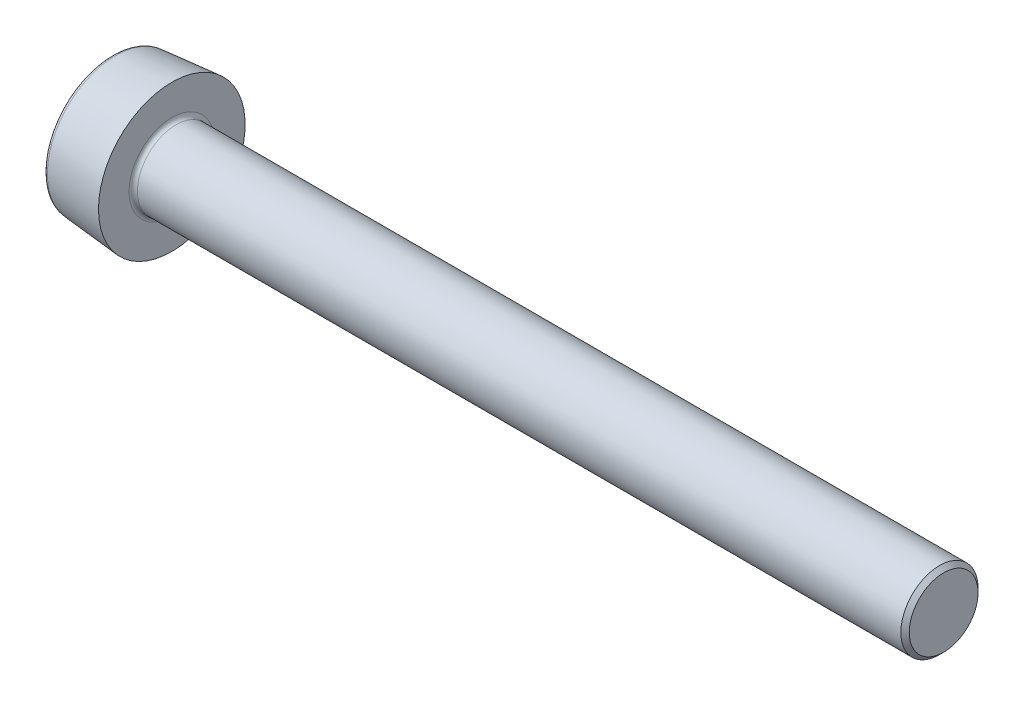
ISO-10303-21;
HEADER;
FILE_DESCRIPTION(('STEP AP214'),'2;1');
FILE_NAME('part.step','',(''),(''),'','','');
FILE_SCHEMA(('AUTOMOTIVE_DESIGN { 1 0 10303 214 1 1 1 1 }'));
ENDSEC;
DATA;
#1=APPLICATION_CONTEXT('core data for automotive mechanical design processes');
#2=APPLICATION_PROTOCOL_DEFINITION('international standard','automotive_design',2000,#1);
#3=PRODUCT_CONTEXT('',#1,'mechanical');
#4=PRODUCT('Part','Part','',(#3));
#5=PRODUCT_RELATED_PRODUCT_CATEGORY('part','',(#4));
#6=PRODUCT_DEFINITION_FORMATION('','',#4);
#7=PRODUCT_DEFINITION_CONTEXT('part definition',#1,'design');
#8=PRODUCT_DEFINITION('design','',#6,#7);
#9=PRODUCT_DEFINITION_SHAPE('','',#8);
#10=(LENGTH_UNIT() NAMED_UNIT(*) SI_UNIT(.MILLI.,.METRE.));
#11=(NAMED_UNIT(*) PLANE_ANGLE_UNIT() SI_UNIT($,.RADIAN.));
#12=(NAMED_UNIT(*) SI_UNIT($,.STERADIAN.) SOLID_ANGLE_UNIT());
#13=UNCERTAINTY_MEASURE_WITH_UNIT(LENGTH_MEASURE(1.E-05),#10,'distance_accuracy_value','');
#14=(GEOMETRIC_REPRESENTATION_CONTEXT(3) GLOBAL_UNCERTAINTY_ASSIGNED_CONTEXT((#13)) GLOBAL_UNIT_ASSIGNED_CONTEXT((#10,
#11,#12)) REPRESENTATION_CONTEXT('',''));
#15=CARTESIAN_POINT('',(0.,0.,0.));
#16=DIRECTION('',(0.,0.,1.));
#17=DIRECTION('',(1.,0.,0.));
#18=AXIS2_PLACEMENT_3D('',#15,#16,#17);
#19=CARTESIAN_POINT('',(0.,0.,0.));
#20=DIRECTION('',(-1.,0.,0.));
#21=DIRECTION('',(0.,0.,1.));
#22=AXIS2_PLACEMENT_3D('',#19,#20,#21);
#23=CYLINDRICAL_SURFACE('',#22,1.);
#24=CARTESIAN_POINT('',(19.89175,0.,0.));
#25=DIRECTION('',(-1.,0.,0.));
#26=DIRECTION('',(0.,0.,1.));
#27=AXIS2_PLACEMENT_3D('',#24,#25,#26);
#28=CIRCLE('',#27,1.);
#29=CARTESIAN_POINT('',(19.89175,0.,1.));
#30=VERTEX_POINT('',#29);
#31=EDGE_CURVE('E322',#30,#30,#28,.T.);
#32=ORIENTED_EDGE('',*,*,#31,.T.);
#33=EDGE_LOOP('',(#32));
#34=FACE_BOUND('',#33,.T.);
#35=CARTESIAN_POINT('',(0.108249999999998,0.,0.));
#36=DIRECTION('',(-1.,0.,0.));
#37=DIRECTION('',(0.,0.,1.));
#38=AXIS2_PLACEMENT_3D('',#35,#36,#37);
#39=CIRCLE('',#38,1.);
#40=CARTESIAN_POINT('',(0.108249999999998,0.,1.));
#41=VERTEX_POINT('',#40);
#42=EDGE_CURVE('E11',#41,#41,#39,.T.);
#43=ORIENTED_EDGE('',*,*,#42,.F.);
#44=EDGE_LOOP('',(#43));
#45=FACE_BOUND('',#44,.T.);
#46=ADVANCED_FACE('F17',(#34,#45),#23,.T.);
#47=CARTESIAN_POINT('',(0.108249999999998,0.,0.));
#48=DIRECTION('',(-1.,0.,0.));
#49=DIRECTION('',(0.,0.,1.));
#50=AXIS2_PLACEMENT_3D('',#47,#48,#49);
#51=TOROIDAL_SURFACE('',#50,1.10825,0.10825);
#52=ORIENTED_EDGE('',*,*,#42,.T.);
#53=EDGE_LOOP('',(#52));
#54=FACE_BOUND('',#53,.T.);
#55=CARTESIAN_POINT('',(0.,0.,0.));
#56=DIRECTION('',(-1.,0.,0.));
#57=DIRECTION('',(0.,0.,1.));
#58=AXIS2_PLACEMENT_3D('',#55,#56,#57);
#59=CIRCLE('',#58,1.10825);
#60=CARTESIAN_POINT('',(0.,0.,1.10825));
#61=VERTEX_POINT('',#60);
#62=EDGE_CURVE('E25',#61,#61,#59,.T.);
#63=ORIENTED_EDGE('',*,*,#62,.F.);
#64=EDGE_LOOP('',(#63));
#65=FACE_BOUND('',#64,.T.);
#66=ADVANCED_FACE('F354',(#54,#65),#51,.F.);
#67=CARTESIAN_POINT('',(0.,1.10825,0.));
#68=DIRECTION('',(-1.,0.,0.));
#69=DIRECTION('',(0.,0.,1.));
#70=AXIS2_PLACEMENT_3D('',#67,#68,#69);
#71=PLANE('',#70);
#72=CARTESIAN_POINT('',(0.,0.,0.));
#73=DIRECTION('',(-1.,0.,0.));
#74=DIRECTION('',(0.,0.,1.));
#75=AXIS2_PLACEMENT_3D('',#72,#73,#74);
#76=CIRCLE('',#75,1.9);
#77=CARTESIAN_POINT('',(0.,0.,1.9));
#78=VERTEX_POINT('',#77);
#79=EDGE_CURVE('E342',#78,#78,#76,.T.);
#80=ORIENTED_EDGE('',*,*,#79,.F.);
#81=EDGE_LOOP('',(#80));
#82=FACE_BOUND('',#81,.T.);
#83=ORIENTED_EDGE('',*,*,#62,.T.);
#84=EDGE_LOOP('',(#83));
#85=FACE_BOUND('',#84,.T.);
#86=ADVANCED_FACE('F352',(#82,#85),#71,.F.);
#87=CARTESIAN_POINT('',(-1.45118460915243,0.,0.));
#88=DIRECTION('',(1.,0.,0.));
#89=DIRECTION('',(0.,0.,-1.));
#90=AXIS2_PLACEMENT_3D('',#87,#88,#89);
#91=CONICAL_SURFACE('',#90,1.77303779801586,0.0872664625997164);
#92=ORIENTED_EDGE('',*,*,#79,.T.);
#93=EDGE_LOOP('',(#92));
#94=FACE_BOUND('',#93,.T.);
#95=CARTESIAN_POINT('',(-1.45118460915243,0.,0.));
#96=DIRECTION('',(-1.,0.,0.));
#97=DIRECTION('',(0.,0.,1.));
#98=AXIS2_PLACEMENT_3D('',#95,#96,#97);
#99=CIRCLE('',#98,1.77303779801586);
#100=CARTESIAN_POINT('',(-1.45118460915243,0.,1.77303779801586));
#101=VERTEX_POINT('',#100);
#102=EDGE_CURVE('E338',#101,#101,#99,.T.);
#103=ORIENTED_EDGE('',*,*,#102,.F.);
#104=EDGE_LOOP('',(#103));
#105=FACE_BOUND('',#104,.T.);
#106=ADVANCED_FACE('F362',(#94,#105),#91,.T.);
#107=CARTESIAN_POINT('',(-1.44175,0.,0.));
#108=DIRECTION('',(-1.,0.,0.));
#109=DIRECTION('',(0.,0.,1.));
#110=AXIS2_PLACEMENT_3D('',#107,#108,#109);
#111=TOROIDAL_SURFACE('',#110,1.66519972194743,0.10825);
#112=CARTESIAN_POINT('',(-1.55,0.,0.));
#113=DIRECTION('',(-1.,0.,0.));
#114=DIRECTION('',(0.,0.,1.));
#115=AXIS2_PLACEMENT_3D('',#112,#113,#114);
#116=CIRCLE('',#115,1.66519972194743);
#117=CARTESIAN_POINT('',(-1.55,0.,1.66519972194743));
#118=VERTEX_POINT('',#117);
#119=EDGE_CURVE('E334',#118,#118,#116,.T.);
#120=ORIENTED_EDGE('',*,*,#119,.F.);
#121=EDGE_LOOP('',(#120));
#122=FACE_BOUND('',#121,.T.);
#123=ORIENTED_EDGE('',*,*,#102,.T.);
#124=EDGE_LOOP('',(#123));
#125=FACE_BOUND('',#124,.T.);
#126=ADVANCED_FACE('F369',(#122,#125),#111,.T.);
#127=CARTESIAN_POINT('',(-1.55,0.,0.));
#128=DIRECTION('',(-1.,0.,0.));
#129=DIRECTION('',(0.,0.,1.));
#130=AXIS2_PLACEMENT_3D('',#127,#128,#129);
#131=PLANE('',#130);
#132=CARTESIAN_POINT('',(-1.55,-1.06088111963594,-0.6125));
#133=DIRECTION('',(1.,0.,0.));
#134=DIRECTION('',(0.,0.,-1.));
#135=AXIS2_PLACEMENT_3D('',#132,#133,#134);
#136=CIRCLE('',#135,0.554830537352329);
#137=CARTESIAN_POINT('',(-1.55,-0.514312095755914,-0.707889870078079));
#138=VERTEX_POINT('',#137);
#139=CARTESIAN_POINT('',(-1.55,-0.870206658447239,-0.0914624053591971));
#140=VERTEX_POINT('',#139);
#141=EDGE_CURVE('E217',#138,#140,#136,.T.);
#142=ORIENTED_EDGE('',*,*,#141,.F.);
#143=CARTESIAN_POINT('',(-1.55,0.,0.));
#144=DIRECTION('',(-1.,0.,0.));
#145=DIRECTION('',(0.,0.,1.));
#146=AXIS2_PLACEMENT_3D('',#143,#144,#145);
#147=CIRCLE('',#146,0.875);
#148=CARTESIAN_POINT('',(-1.55,-0.355894562691325,-0.799352275437276));
#149=VERTEX_POINT('',#148);
#150=EDGE_CURVE('E156',#149,#138,#147,.T.);
#151=ORIENTED_EDGE('',*,*,#150,.F.);
#152=CARTESIAN_POINT('',(-1.55,0.,-1.225));
#153=DIRECTION('',(1.,0.,0.));
#154=DIRECTION('',(0.,0.,-1.));
#155=AXIS2_PLACEMENT_3D('',#152,#153,#154);
#156=CIRCLE('',#155,0.554830537352329);
#157=CARTESIAN_POINT('',(-1.55,0.355894562691326,-0.799352275437276));
#158=VERTEX_POINT('',#157);
#159=EDGE_CURVE('E213',#158,#149,#156,.T.);
#160=ORIENTED_EDGE('',*,*,#159,.F.);
#161=CARTESIAN_POINT('',(-1.55,0.514312095755914,-0.707889870078079));
#162=VERTEX_POINT('',#161);
#163=EDGE_CURVE('E148',#162,#158,#147,.T.);
#164=ORIENTED_EDGE('',*,*,#163,.F.);
#165=CARTESIAN_POINT('',(-1.55,1.06088111963594,-0.6125));
#166=DIRECTION('',(1.,0.,0.));
#167=DIRECTION('',(0.,0.,-1.));
#168=AXIS2_PLACEMENT_3D('',#165,#166,#167);
#169=CIRCLE('',#168,0.554830537352329);
#170=CARTESIAN_POINT('',(-1.55,0.87020665844724,-0.0914624053591967));
#171=VERTEX_POINT('',#170);
#172=EDGE_CURVE('E209',#171,#162,#169,.T.);
#173=ORIENTED_EDGE('',*,*,#172,.F.);
#174=CARTESIAN_POINT('',(-1.55,0.870206658447239,0.0914624053591969));
#175=VERTEX_POINT('',#174);
#176=EDGE_CURVE('E136',#175,#171,#147,.T.);
#177=ORIENTED_EDGE('',*,*,#176,.F.);
#178=CARTESIAN_POINT('',(-1.55,1.06088111963594,0.6125));
#179=DIRECTION('',(1.,0.,0.));
#180=DIRECTION('',(0.,0.,-1.));
#181=AXIS2_PLACEMENT_3D('',#178,#179,#180);
#182=CIRCLE('',#181,0.554830537352329);
#183=CARTESIAN_POINT('',(-1.55,0.514312095755914,0.707889870078079));
#184=VERTEX_POINT('',#183);
#185=EDGE_CURVE('E133',#184,#175,#182,.T.);
#186=ORIENTED_EDGE('',*,*,#185,.F.);
#187=CARTESIAN_POINT('',(-1.55,0.355894562691326,0.799352275437276));
#188=VERTEX_POINT('',#187);
#189=EDGE_CURVE('E32',#188,#184,#147,.T.);
#190=ORIENTED_EDGE('',*,*,#189,.F.);
#191=CARTESIAN_POINT('',(-1.55,0.,1.225));
#192=DIRECTION('',(1.,0.,0.));
#193=DIRECTION('',(0.,0.,-1.));
#194=AXIS2_PLACEMENT_3D('',#191,#192,#193);
#195=CIRCLE('',#194,0.554830537352329);
#196=CARTESIAN_POINT('',(-1.55,-0.355894562691325,0.799352275437276));
#197=VERTEX_POINT('',#196);
#198=EDGE_CURVE('E119',#197,#188,#195,.T.);
#199=ORIENTED_EDGE('',*,*,#198,.F.);
#200=CARTESIAN_POINT('',(-1.55,-0.514312095755914,0.707889870078079));
#201=VERTEX_POINT('',#200);
#202=EDGE_CURVE('E138',#201,#197,#147,.T.);
#203=ORIENTED_EDGE('',*,*,#202,.F.);
#204=CARTESIAN_POINT('',(-1.55,-1.06088111963594,0.6125));
#205=DIRECTION('',(1.,0.,0.));
#206=DIRECTION('',(0.,0.,-1.));
#207=AXIS2_PLACEMENT_3D('',#204,#205,#206);
#208=CIRCLE('',#207,0.554830537352329);
#209=CARTESIAN_POINT('',(-1.55,-0.870206658447239,0.091462405359197));
#210=VERTEX_POINT('',#209);
#211=EDGE_CURVE('E125',#210,#201,#208,.T.);
#212=ORIENTED_EDGE('',*,*,#211,.F.);
#213=EDGE_CURVE('E151',#140,#210,#147,.T.);
#214=ORIENTED_EDGE('',*,*,#213,.F.);
#215=EDGE_LOOP('',(#142,#151,#160,#164,#173,#177,#186,#190,#199,#203,#212,#214));
#216=FACE_BOUND('',#215,.T.);
#217=ORIENTED_EDGE('',*,*,#119,.T.);
#218=EDGE_LOOP('',(#217));
#219=FACE_BOUND('',#218,.T.);
#220=ADVANCED_FACE('F129',(#216,#219),#131,.T.);
#221=CARTESIAN_POINT('',(20.,0.,0.));
#222=DIRECTION('',(-1.,0.,0.));
#223=DIRECTION('',(0.,0.,1.));
#224=AXIS2_PLACEMENT_3D('',#221,#222,#223);
#225=PLANE('',#224);
#226=CARTESIAN_POINT('',(20.,0.,0.));
#227=DIRECTION('',(-1.,0.,0.));
#228=DIRECTION('',(0.,0.,1.));
#229=AXIS2_PLACEMENT_3D('',#226,#227,#228);
#230=CIRCLE('',#229,0.89175);
#231=CARTESIAN_POINT('',(20.,0.,0.89175));
#232=VERTEX_POINT('',#231);
#233=EDGE_CURVE('E330',#232,#232,#230,.T.);
#234=ORIENTED_EDGE('',*,*,#233,.F.);
#235=EDGE_LOOP('',(#234));
#236=FACE_BOUND('',#235,.T.);
#237=ADVANCED_FACE('F376',(#236),#225,.F.);
#238=CARTESIAN_POINT('',(19.89175,0.,0.));
#239=DIRECTION('',(-1.,0.,0.));
#240=DIRECTION('',(0.,0.,1.));
#241=AXIS2_PLACEMENT_3D('',#238,#239,#240);
#242=CONICAL_SURFACE('',#241,1.,0.785398163397445);
#243=ORIENTED_EDGE('',*,*,#233,.T.);
#244=EDGE_LOOP('',(#243));
#245=FACE_BOUND('',#244,.T.);
#246=ORIENTED_EDGE('',*,*,#31,.F.);
#247=EDGE_LOOP('',(#246));
#248=FACE_BOUND('',#247,.T.);
#249=ADVANCED_FACE('F379',(#245,#248),#242,.T.);
#250=CARTESIAN_POINT('',(-1.55,0.,0.));
#251=DIRECTION('',(-1.,0.,0.));
#252=DIRECTION('',(0.,0.,1.));
#253=AXIS2_PLACEMENT_3D('',#250,#251,#252);
#254=CYLINDRICAL_SURFACE('',#253,0.875);
#255=ORIENTED_EDGE('',*,*,#176,.T.);
#256=DIRECTION('',(-1.,0.,0.));
#257=VECTOR('',#256,1.);
#258=CARTESIAN_POINT('',(0.,0.87020665844724,-0.0914624053591966));
#259=LINE('',#258,#257);
#260=CARTESIAN_POINT('',(-0.71,0.870206658447239,-0.0914624053591966));
#261=VERTEX_POINT('',#260);
#262=EDGE_CURVE('E203',#261,#171,#259,.T.);
#263=ORIENTED_EDGE('',*,*,#262,.F.);
#264=CARTESIAN_POINT('',(-0.71,0.,0.));
#265=DIRECTION('',(-1.,0.,0.));
#266=DIRECTION('',(0.,0.,1.));
#267=AXIS2_PLACEMENT_3D('',#264,#265,#266);
#268=CIRCLE('',#267,0.875);
#269=CARTESIAN_POINT('',(-0.71,0.870206658447239,0.0914624053591969));
#270=VERTEX_POINT('',#269);
#271=EDGE_CURVE('E158',#270,#261,#268,.T.);
#272=ORIENTED_EDGE('',*,*,#271,.F.);
#273=DIRECTION('',(-1.,0.,0.));
#274=VECTOR('',#273,1.);
#275=CARTESIAN_POINT('',(0.,0.870206658447239,0.091462405359197));
#276=LINE('',#275,#274);
#277=EDGE_CURVE('E124',#270,#175,#276,.T.);
#278=ORIENTED_EDGE('',*,*,#277,.T.);
#279=EDGE_LOOP('',(#255,#263,#272,#278));
#280=FACE_BOUND('',#279,.T.);
#281=ADVANCED_FACE('F382',(#280),#254,.F.);
#282=CARTESIAN_POINT('',(-0.71,0.355894562691326,0.799352275437276));
#283=VERTEX_POINT('',#282);
#284=CARTESIAN_POINT('',(-0.71,0.514312095755914,0.707889870078079));
#285=VERTEX_POINT('',#284);
#286=EDGE_CURVE('E113',#283,#285,#268,.T.);
#287=ORIENTED_EDGE('',*,*,#286,.F.);
#288=DIRECTION('',(-1.,0.,0.));
#289=VECTOR('',#288,1.);
#290=CARTESIAN_POINT('',(0.,0.355894562691326,0.799352275437276));
#291=LINE('',#290,#289);
#292=EDGE_CURVE('E109',#283,#188,#291,.T.);
#293=ORIENTED_EDGE('',*,*,#292,.T.);
#294=ORIENTED_EDGE('',*,*,#189,.T.);
#295=DIRECTION('',(-1.,0.,0.));
#296=VECTOR('',#295,1.);
#297=CARTESIAN_POINT('',(0.,0.514312095755914,0.707889870078079));
#298=LINE('',#297,#296);
#299=EDGE_CURVE('E116',#285,#184,#298,.T.);
#300=ORIENTED_EDGE('',*,*,#299,.F.);
#301=EDGE_LOOP('',(#287,#293,#294,#300));
#302=FACE_BOUND('',#301,.T.);
#303=ADVANCED_FACE('F111',(#302),#254,.F.);
#304=CARTESIAN_POINT('',(-0.71,-0.514312095755914,0.70788987007808));
#305=VERTEX_POINT('',#304);
#306=CARTESIAN_POINT('',(-0.71,-0.355894562691325,0.799352275437276));
#307=VERTEX_POINT('',#306);
#308=EDGE_CURVE('E159',#305,#307,#268,.T.);
#309=ORIENTED_EDGE('',*,*,#308,.F.);
#310=DIRECTION('',(-1.,0.,0.));
#311=VECTOR('',#310,1.);
#312=CARTESIAN_POINT('',(0.,-0.514312095755914,0.70788987007808));
#313=LINE('',#312,#311);
#314=EDGE_CURVE('E183',#305,#201,#313,.T.);
#315=ORIENTED_EDGE('',*,*,#314,.T.);
#316=ORIENTED_EDGE('',*,*,#202,.T.);
#317=DIRECTION('',(-1.,0.,0.));
#318=VECTOR('',#317,1.);
#319=CARTESIAN_POINT('',(0.,-0.355894562691325,0.799352275437276));
#320=LINE('',#319,#318);
#321=EDGE_CURVE('E40',#307,#197,#320,.T.);
#322=ORIENTED_EDGE('',*,*,#321,.F.);
#323=EDGE_LOOP('',(#309,#315,#316,#322));
#324=FACE_BOUND('',#323,.T.);
#325=ADVANCED_FACE('F395',(#324),#254,.F.);
#326=CARTESIAN_POINT('',(-0.71,-0.870206658447239,-0.0914624053591971));
#327=VERTEX_POINT('',#326);
#328=CARTESIAN_POINT('',(-0.71,-0.870206658447239,0.0914624053591971));
#329=VERTEX_POINT('',#328);
#330=EDGE_CURVE('E169',#327,#329,#268,.T.);
#331=ORIENTED_EDGE('',*,*,#330,.F.);
#332=DIRECTION('',(-1.,0.,0.));
#333=VECTOR('',#332,1.);
#334=CARTESIAN_POINT('',(0.,-0.870206658447239,-0.0914624053591971));
#335=LINE('',#334,#333);
#336=EDGE_CURVE('E188',#327,#140,#335,.T.);
#337=ORIENTED_EDGE('',*,*,#336,.T.);
#338=ORIENTED_EDGE('',*,*,#213,.T.);
#339=DIRECTION('',(-1.,0.,0.));
#340=VECTOR('',#339,1.);
#341=CARTESIAN_POINT('',(0.,-0.870206658447239,0.0914624053591971));
#342=LINE('',#341,#340);
#343=EDGE_CURVE('E185',#329,#210,#342,.T.);
#344=ORIENTED_EDGE('',*,*,#343,.F.);
#345=EDGE_LOOP('',(#331,#337,#338,#344));
#346=FACE_BOUND('',#345,.T.);
#347=ADVANCED_FACE('F232',(#346),#254,.F.);
#348=CARTESIAN_POINT('',(-0.71,-0.355894562691325,-0.799352275437276));
#349=VERTEX_POINT('',#348);
#350=CARTESIAN_POINT('',(-0.71,-0.514312095755914,-0.707889870078079));
#351=VERTEX_POINT('',#350);
#352=EDGE_CURVE('E175',#349,#351,#268,.T.);
#353=ORIENTED_EDGE('',*,*,#352,.F.);
#354=DIRECTION('',(-1.,0.,0.));
#355=VECTOR('',#354,1.);
#356=CARTESIAN_POINT('',(0.,-0.355894562691325,-0.799352275437276));
#357=LINE('',#356,#355);
#358=EDGE_CURVE('E194',#349,#149,#357,.T.);
#359=ORIENTED_EDGE('',*,*,#358,.T.);
#360=ORIENTED_EDGE('',*,*,#150,.T.);
#361=DIRECTION('',(-1.,0.,0.));
#362=VECTOR('',#361,1.);
#363=CARTESIAN_POINT('',(0.,-0.514312095755914,-0.707889870078079));
#364=LINE('',#363,#362);
#365=EDGE_CURVE('E191',#351,#138,#364,.T.);
#366=ORIENTED_EDGE('',*,*,#365,.F.);
#367=EDGE_LOOP('',(#353,#359,#360,#366));
#368=FACE_BOUND('',#367,.T.);
#369=ADVANCED_FACE('F242',(#368),#254,.F.);
#370=CARTESIAN_POINT('',(-0.71,0.514312095755914,-0.707889870078079));
#371=VERTEX_POINT('',#370);
#372=CARTESIAN_POINT('',(-0.71,0.355894562691326,-0.799352275437276));
#373=VERTEX_POINT('',#372);
#374=EDGE_CURVE('E165',#371,#373,#268,.T.);
#375=ORIENTED_EDGE('',*,*,#374,.F.);
#376=DIRECTION('',(-1.,0.,0.));
#377=VECTOR('',#376,1.);
#378=CARTESIAN_POINT('',(0.,0.514312095755914,-0.707889870078079));
#379=LINE('',#378,#377);
#380=EDGE_CURVE('E200',#371,#162,#379,.T.);
#381=ORIENTED_EDGE('',*,*,#380,.T.);
#382=ORIENTED_EDGE('',*,*,#163,.T.);
#383=DIRECTION('',(-1.,0.,0.));
#384=VECTOR('',#383,1.);
#385=CARTESIAN_POINT('',(0.,0.355894562691326,-0.799352275437276));
#386=LINE('',#385,#384);
#387=EDGE_CURVE('E197',#373,#158,#386,.T.);
#388=ORIENTED_EDGE('',*,*,#387,.F.);
#389=EDGE_LOOP('',(#375,#381,#382,#388));
#390=FACE_BOUND('',#389,.T.);
#391=ADVANCED_FACE('F253',(#390),#254,.F.);
#392=CARTESIAN_POINT('',(-0.71,0.,0.));
#393=DIRECTION('',(-1.,0.,0.));
#394=DIRECTION('',(0.,0.,1.));
#395=AXIS2_PLACEMENT_3D('',#392,#393,#394);
#396=CONICAL_SURFACE('',#395,0.875,1.0471975511966);
#397=CARTESIAN_POINT('',(-0.204818514459078,0.,0.));
#398=VERTEX_POINT('',#397);
#399=VERTEX_LOOP('',#398);
#400=FACE_BOUND('',#399,.T.);
#401=ORIENTED_EDGE('',*,*,#271,.T.);
#402=CARTESIAN_POINT('',(-0.710001052626692,0.51431244480936,-0.707891870078079));
#403=CARTESIAN_POINT('',(-0.702605220680132,0.511861449112985,-0.693833740382595));
#404=CARTESIAN_POINT('',(-0.695348661380436,0.509937089870482,-0.679618054209384));
#405=CARTESIAN_POINT('',(-0.681199870715218,0.50718976377691,-0.650873032869013));
#406=CARTESIAN_POINT('',(-0.674308268643652,0.506368643409787,-0.636343213123692));
#407=CARTESIAN_POINT('',(-0.654215385114916,0.505637574613548,-0.592066869281839));
#408=CARTESIAN_POINT('',(-0.641746200439491,0.507510629894216,-0.561912309856809));
#409=CARTESIAN_POINT('',(-0.622846907764662,0.515323183492735,-0.50892923404188));
#410=CARTESIAN_POINT('',(-0.615687494087997,0.5201063376338,-0.486189543720208));
#411=CARTESIAN_POINT('',(-0.603898920575902,0.532712947288116,-0.440970423896295));
#412=CARTESIAN_POINT('',(-0.59925902722865,0.54052325879175,-0.41849029610236));
#413=CARTESIAN_POINT('',(-0.593072757269823,0.559273167081217,-0.37415151229019));
#414=CARTESIAN_POINT('',(-0.591555375837922,0.570241025665982,-0.352300522844287));
#415=CARTESIAN_POINT('',(-0.591963527288072,0.594957405131819,-0.310264253305604));
#416=CARTESIAN_POINT('',(-0.593889364414075,0.608706171639652,-0.290079120573357));
#417=CARTESIAN_POINT('',(-0.600469111407169,0.636765414220176,-0.25413524483107));
#418=CARTESIAN_POINT('',(-0.604798955548615,0.650846973433819,-0.238133843054563));
#419=CARTESIAN_POINT('',(-0.615464899179857,0.680388352477729,-0.208139690747695));
#420=CARTESIAN_POINT('',(-0.621807074260817,0.695852242914255,-0.194153212042537));
#421=CARTESIAN_POINT('',(-0.639842908339476,0.736461806313988,-0.161288232915976));
#422=CARTESIAN_POINT('',(-0.65257616335824,0.762322500597224,-0.143852127606062));
#423=CARTESIAN_POINT('',(-0.673193458802746,0.80216128334655,-0.121448322340417));
#424=CARTESIAN_POINT('',(-0.680290511638441,0.815565318045385,-0.114623385592609));
#425=CARTESIAN_POINT('',(-0.694876453459336,0.842670824659511,-0.10216470001572));
#426=CARTESIAN_POINT('',(-0.702364535245654,0.856371652144609,-0.0965286095792647));
#427=CARTESIAN_POINT('',(-0.71000110420552,0.87020865844724,-0.0914616734606572));
#428=B_SPLINE_CURVE_WITH_KNOTS('',3,(#402,#403,#404,#405,#406,#407,#408,#409,#410,#411,#412,
#413,#414,#415,#416,#417,#418,#419,#420,#421,#422,#423,#424,#425,#426,#427),.UNSPECIFIED.,.F.,
.F.,(4,2,2,2,2,2,2,2,2,2,2,2,4),(0.,0.0481925322428017,0.0964656239616364,0.193964476932186,
0.2666476155972,0.339018634899243,0.412058702550792,0.485105224366299,0.550100984529281,
0.615294876404684,0.715729377907706,0.765588419744608,0.815348320436132),.UNSPECIFIED.);
#429=EDGE_CURVE('E135',#371,#261,#428,.T.);
#430=ORIENTED_EDGE('',*,*,#429,.F.);
#431=ORIENTED_EDGE('',*,*,#374,.T.);
#432=CARTESIAN_POINT('',(-0.710001351667692,-0.355896562691325,-0.799353947694597));
#433=CARTESIAN_POINT('',(-0.702605509425064,-0.344947364503633,-0.7902022401547));
#434=CARTESIAN_POINT('',(-0.695348939525855,-0.333598399365442,-0.781427835212509));
#435=CARTESIAN_POINT('',(-0.681200127013077,-0.310078143306246,-0.764676035223396));
#436=CARTESIAN_POINT('',(-0.674308513691921,-0.2979055094846,-0.756699996989411));
#437=CARTESIAN_POINT('',(-0.65421559508807,-0.259926599767232,-0.733928649691764));
#438=CARTESIAN_POINT('',(-0.641746385559962,-0.232875450586855,-0.720473450515075));
#439=CARTESIAN_POINT('',(-0.622847050314615,-0.183084471733879,-0.700747730682423));
#440=CARTESIAN_POINT('',(-0.615687618781017,-0.160999741869388,-0.693520198116896));
#441=CARTESIAN_POINT('',(-0.603899008311938,-0.115535519735332,-0.681828242709701));
#442=CARTESIAN_POINT('',(-0.599259095882154,-0.0921619947432032,-0.677352087684612));
#443=CARTESIAN_POINT('',(-0.593072788497883,-0.0443885064909393,-0.671420556035547));
#444=CARTESIAN_POINT('',(-0.591555388847561,-0.0199810517014798,-0.669993488266625));
#445=CARTESIAN_POINT('',(-0.59196350847895,0.0287816464073432,-0.670380335833328));
#446=CARTESIAN_POINT('',(-0.593889331951944,0.0531368849233457,-0.672194537518645));
#447=CARTESIAN_POINT('',(-0.600469057099951,0.098294837459113,-0.678522594852713));
#448=CARTESIAN_POINT('',(-0.604798890892469,0.119193241970638,-0.682716871289768));
#449=CARTESIAN_POINT('',(-0.615464816245447,0.159939640013102,-0.693303359766989));
#450=CARTESIAN_POINT('',(-0.621806983445828,0.17978423726785,-0.699702233017465));
#451=CARTESIAN_POINT('',(-0.639842845916377,0.228551065651935,-0.718438682249207));
#452=CARTESIAN_POINT('',(-0.652576153715208,0.256581644311438,-0.732116702627755));
#453=CARTESIAN_POINT('',(-0.673193539582896,0.295903458736222,-0.75541630261453));
#454=CARTESIAN_POINT('',(-0.680290624190807,0.30851609332687,-0.763612107136306));
#455=CARTESIAN_POINT('',(-0.694876631931881,0.332858474434854,-0.780856904797249));
#456=CARTESIAN_POINT('',(-0.702364747850179,0.344589926665725,-0.78990416900331));
#457=CARTESIAN_POINT('',(-0.710001351667692,0.355896562691326,-0.799353947694597));
#458=B_SPLINE_CURVE_WITH_KNOTS('',3,(#432,#433,#434,#435,#436,#437,#438,#439,#440,#441,#442,
#443,#444,#445,#446,#447,#448,#449,#450,#451,#452,#453,#454,#455,#456,#457),.UNSPECIFIED.,.F.,
.F.,(4,2,2,2,2,2,2,2,2,2,2,2,4),(0.,0.0481925745386227,0.0964657085632546,0.193964647597126,
0.266647829271179,0.339018891746526,0.412059005611536,0.485105572518673,0.550101332931432,
0.615295226412752,0.715730148920682,0.765589398380348,0.815349504960179),.UNSPECIFIED.);
#459=EDGE_CURVE('E144',#349,#373,#458,.T.);
#460=ORIENTED_EDGE('',*,*,#459,.F.);
#461=ORIENTED_EDGE('',*,*,#352,.T.);
#462=CARTESIAN_POINT('',(-0.71000110420552,-0.870208658447239,-0.0914616734606572));
#463=CARTESIAN_POINT('',(-0.702605270483156,-0.856808460563011,-0.0963681119944429));
#464=CARTESIAN_POINT('',(-0.695348709355316,-0.843535132966667,-0.1018094094608));
#465=CARTESIAN_POINT('',(-0.681199914921939,-0.817267545925777,-0.113802662970452));
#466=CARTESIAN_POINT('',(-0.674308310910093,-0.804273790066064,-0.120356460405081));
#467=CARTESIAN_POINT('',(-0.654215421331478,-0.765563808982452,-0.141861504589476));
#468=CARTESIAN_POINT('',(-0.641746232369308,-0.740385716596228,-0.158560895970153));
#469=CARTESIAN_POINT('',(-0.622846932351308,-0.69840729495712,-0.191818301151553));
#470=CARTESIAN_POINT('',(-0.615687515594298,-0.681105719201868,-0.207330478043437));
#471=CARTESIAN_POINT('',(-0.603898935708129,-0.648248110661504,-0.24085768036086));
#472=CARTESIAN_POINT('',(-0.599259039069877,-0.632684901135286,-0.258861671884819));
#473=CARTESIAN_POINT('',(-0.593072762656979,-0.603661334850991,-0.297268960650984));
#474=CARTESIAN_POINT('',(-0.591555378082692,-0.590221748451516,-0.317692900065157));
#475=CARTESIAN_POINT('',(-0.591963524042721,-0.566175453695235,-0.360116049381058));
#476=CARTESIAN_POINT('',(-0.593889358814001,-0.555568995763988,-0.382115398318397));
#477=CARTESIAN_POINT('',(-0.600469102044498,-0.538470302423355,-0.424387354485704));
#478=CARTESIAN_POINT('',(-0.604798944408623,-0.531653459607181,-0.444583043150671));
#479=CARTESIAN_POINT('',(-0.615464884893508,-0.520448447353794,-0.485163703887798));
#480=CARTESIAN_POINT('',(-0.621807058608202,-0.516067744781761,-0.505549065296823));
#481=CARTESIAN_POINT('',(-0.639842886366344,-0.507910616447085,-0.557150459345471));
#482=CARTESIAN_POINT('',(-0.652576135596162,-0.505740850550957,-0.588264521282897));
#483=CARTESIAN_POINT('',(-0.673193422164066,-0.50625797112999,-0.633967809278167));
#484=CARTESIAN_POINT('',(-0.680290472014826,-0.507049417464082,-0.64898850817274));
#485=CARTESIAN_POINT('',(-0.694876407856488,-0.509812627131581,-0.678691900496106));
#486=CARTESIAN_POINT('',(-0.702364486648977,-0.511782040360869,-0.693375206634782));
#487=CARTESIAN_POINT('',(-0.710001052626692,-0.51431244480936,-0.707891870078079));
#488=B_SPLINE_CURVE_WITH_KNOTS('',3,(#462,#463,#464,#465,#466,#467,#468,#469,#470,#471,#472,
#473,#474,#475,#476,#477,#478,#479,#480,#481,#482,#483,#484,#485,#486,#487),.UNSPECIFIED.,.F.,
.F.,(4,2,2,2,2,2,2,2,2,2,2,2,4),(0.,0.0481925395375568,0.0964656385528714,0.193964506368626,
0.266647652456066,0.339018679200469,0.412058754800718,0.485105284415885,0.550101044713877,
0.615294936774283,0.715729407998992,0.765588434742314,0.815348320422255),.UNSPECIFIED.);
#489=EDGE_CURVE('E238',#327,#351,#488,.T.);
#490=ORIENTED_EDGE('',*,*,#489,.F.);
#491=ORIENTED_EDGE('',*,*,#330,.T.);
#492=CARTESIAN_POINT('',(-0.710001052626692,-0.514312444809359,0.70789187007808));
#493=CARTESIAN_POINT('',(-0.702605220680132,-0.511861449112985,0.693833740382596));
#494=CARTESIAN_POINT('',(-0.695348661380437,-0.509937089870482,0.679618054209385));
#495=CARTESIAN_POINT('',(-0.681199870715218,-0.50718976377691,0.650873032869013));
#496=CARTESIAN_POINT('',(-0.674308268643652,-0.506368643409787,0.636343213123692));
#497=CARTESIAN_POINT('',(-0.654215385114916,-0.505637574613548,0.592066869281839));
#498=CARTESIAN_POINT('',(-0.641746200439491,-0.507510629894216,0.561912309856809));
#499=CARTESIAN_POINT('',(-0.622846907764663,-0.515323183492735,0.50892923404188));
#500=CARTESIAN_POINT('',(-0.615687494087997,-0.5201063376338,0.486189543720208));
#501=CARTESIAN_POINT('',(-0.603898920575902,-0.532712947288116,0.440970423896295));
#502=CARTESIAN_POINT('',(-0.59925902722865,-0.54052325879175,0.41849029610236));
#503=CARTESIAN_POINT('',(-0.593072757269823,-0.559273167081217,0.37415151229019));
#504=CARTESIAN_POINT('',(-0.591555375837922,-0.570241025665982,0.352300522844287));
#505=CARTESIAN_POINT('',(-0.591963527288072,-0.594957405131819,0.310264253305604));
#506=CARTESIAN_POINT('',(-0.593889364414075,-0.608706171639652,0.290079120573357));
#507=CARTESIAN_POINT('',(-0.600469111407169,-0.636765414220176,0.25413524483107));
#508=CARTESIAN_POINT('',(-0.604798955548614,-0.650846973433819,0.238133843054563));
#509=CARTESIAN_POINT('',(-0.615464899179857,-0.680388352477729,0.208139690747695));
#510=CARTESIAN_POINT('',(-0.621807074260817,-0.695852242914255,0.194153212042538));
#511=CARTESIAN_POINT('',(-0.639842908339476,-0.736461806313988,0.161288232915977));
#512=CARTESIAN_POINT('',(-0.65257616335824,-0.762322500597224,0.143852127606062));
#513=CARTESIAN_POINT('',(-0.673193458802746,-0.80216128334655,0.121448322340418));
#514=CARTESIAN_POINT('',(-0.680290511638441,-0.815565318045385,0.114623385592609));
#515=CARTESIAN_POINT('',(-0.694876453459336,-0.84267082465951,0.102164700015721));
#516=CARTESIAN_POINT('',(-0.702364535245654,-0.856371652144609,0.0965286095792652));
#517=CARTESIAN_POINT('',(-0.71000110420552,-0.870208658447239,0.0914616734606575));
#518=B_SPLINE_CURVE_WITH_KNOTS('',3,(#492,#493,#494,#495,#496,#497,#498,#499,#500,#501,#502,
#503,#504,#505,#506,#507,#508,#509,#510,#511,#512,#513,#514,#515,#516,#517),.UNSPECIFIED.,.F.,
.F.,(4,2,2,2,2,2,2,2,2,2,2,2,4),(0.,0.0481925322428018,0.0964656239616367,0.193964476932187,
0.266647615597201,0.339018634899244,0.412058702550792,0.4851052243663,0.550100984529281,
0.615294876404685,0.715729377907706,0.765588419744608,0.815348320436132),.UNSPECIFIED.);
#519=EDGE_CURVE('E270',#305,#329,#518,.T.);
#520=ORIENTED_EDGE('',*,*,#519,.F.);
#521=ORIENTED_EDGE('',*,*,#308,.T.);
#522=CARTESIAN_POINT('',(-0.710001351667692,0.355896562691326,0.799353947694597));
#523=CARTESIAN_POINT('',(-0.702605509425064,0.344947364503633,0.7902022401547));
#524=CARTESIAN_POINT('',(-0.695348939525856,0.333598399365442,0.781427835212509));
#525=CARTESIAN_POINT('',(-0.681200127013077,0.310078143306246,0.764676035223396));
#526=CARTESIAN_POINT('',(-0.674308513691921,0.2979055094846,0.756699996989411));
#527=CARTESIAN_POINT('',(-0.65421559508807,0.259926599767232,0.733928649691764));
#528=CARTESIAN_POINT('',(-0.641746385559962,0.232875450586855,0.720473450515075));
#529=CARTESIAN_POINT('',(-0.622847050314615,0.183084471733879,0.700747730682423));
#530=CARTESIAN_POINT('',(-0.615687618781017,0.160999741869388,0.693520198116896));
#531=CARTESIAN_POINT('',(-0.603899008311938,0.115535519735333,0.681828242709701));
#532=CARTESIAN_POINT('',(-0.599259095882154,0.0921619947432035,0.677352087684612));
#533=CARTESIAN_POINT('',(-0.593072788497883,0.0443885064909394,0.671420556035547));
#534=CARTESIAN_POINT('',(-0.591555388847561,0.01998105170148,0.669993488266625));
#535=CARTESIAN_POINT('',(-0.59196350847895,-0.028781646407343,0.670380335833328));
#536=CARTESIAN_POINT('',(-0.593889331951944,-0.0531368849233455,0.672194537518645));
#537=CARTESIAN_POINT('',(-0.600469057099951,-0.0982948374591128,0.678522594852713));
#538=CARTESIAN_POINT('',(-0.604798890892469,-0.119193241970638,0.682716871289768));
#539=CARTESIAN_POINT('',(-0.615464816245447,-0.159939640013102,0.693303359766989));
#540=CARTESIAN_POINT('',(-0.621806983445828,-0.17978423726785,0.699702233017465));
#541=CARTESIAN_POINT('',(-0.639842845916377,-0.228551065651935,0.718438682249207));
#542=CARTESIAN_POINT('',(-0.652576153715208,-0.256581644311437,0.732116702627755));
#543=CARTESIAN_POINT('',(-0.673193539582896,-0.295903458736221,0.75541630261453));
#544=CARTESIAN_POINT('',(-0.680290624190807,-0.308516093326869,0.763612107136306));
#545=CARTESIAN_POINT('',(-0.694876631931881,-0.332858474434853,0.780856904797249));
#546=CARTESIAN_POINT('',(-0.702364747850179,-0.344589926665724,0.789904169003309));
#547=CARTESIAN_POINT('',(-0.710001351667692,-0.355896562691325,0.799353947694597));
#548=B_SPLINE_CURVE_WITH_KNOTS('',3,(#522,#523,#524,#525,#526,#527,#528,#529,#530,#531,#532,
#533,#534,#535,#536,#537,#538,#539,#540,#541,#542,#543,#544,#545,#546,#547),.UNSPECIFIED.,.F.,
.F.,(4,2,2,2,2,2,2,2,2,2,2,2,4),(0.,0.0481925745386226,0.0964657085632546,0.193964647597126,
0.266647829271179,0.339018891746526,0.412059005611537,0.485105572518673,0.550101332931432,
0.615295226412753,0.715730148920682,0.765589398380348,0.815349504960179),.UNSPECIFIED.);
#549=EDGE_CURVE('E274',#283,#307,#548,.T.);
#550=ORIENTED_EDGE('',*,*,#549,.F.);
#551=ORIENTED_EDGE('',*,*,#286,.T.);
#552=CARTESIAN_POINT('',(-0.71000110420552,0.870208658447239,0.091461673460657));
#553=CARTESIAN_POINT('',(-0.702605270483156,0.856808460563011,0.0963681119944432));
#554=CARTESIAN_POINT('',(-0.695348709355316,0.843535132966668,0.101809409460801));
#555=CARTESIAN_POINT('',(-0.681199914921939,0.817267545925777,0.113802662970453));
#556=CARTESIAN_POINT('',(-0.674308310910093,0.804273790066065,0.120356460405082));
#557=CARTESIAN_POINT('',(-0.654215421331478,0.765563808982452,0.141861504589477));
#558=CARTESIAN_POINT('',(-0.641746232369308,0.740385716596227,0.158560895970153));
#559=CARTESIAN_POINT('',(-0.622846932351308,0.698407294957121,0.191818301151553));
#560=CARTESIAN_POINT('',(-0.615687515594299,0.681105719201869,0.207330478043438));
#561=CARTESIAN_POINT('',(-0.60389893570813,0.648248110661505,0.240857680360861));
#562=CARTESIAN_POINT('',(-0.599259039069878,0.632684901135286,0.258861671884819));
#563=CARTESIAN_POINT('',(-0.59307276265698,0.603661334850991,0.297268960650984));
#564=CARTESIAN_POINT('',(-0.591555378082693,0.590221748451517,0.317692900065158));
#565=CARTESIAN_POINT('',(-0.591963524042721,0.566175453695237,0.360116049381058));
#566=CARTESIAN_POINT('',(-0.593889358814,0.555568995763989,0.382115398318397));
#567=CARTESIAN_POINT('',(-0.600469102044498,0.538470302423356,0.424387354485704));
#568=CARTESIAN_POINT('',(-0.604798944408624,0.531653459607184,0.444583043150671));
#569=CARTESIAN_POINT('',(-0.615464884893509,0.520448447353795,0.485163703887798));
#570=CARTESIAN_POINT('',(-0.621807058608202,0.516067744781761,0.505549065296823));
#571=CARTESIAN_POINT('',(-0.639842886366343,0.507910616447085,0.557150459345471));
#572=CARTESIAN_POINT('',(-0.652576135596163,0.505740850550959,0.588264521282896));
#573=CARTESIAN_POINT('',(-0.673193422164067,0.506257971129992,0.633967809278167));
#574=CARTESIAN_POINT('',(-0.680290472014827,0.507049417464084,0.64898850817274));
#575=CARTESIAN_POINT('',(-0.694876407856489,0.509812627131583,0.678691900496106));
#576=CARTESIAN_POINT('',(-0.702364486648977,0.51178204036087,0.693375206634782));
#577=CARTESIAN_POINT('',(-0.710001052626693,0.51431244480936,0.707891870078079));
#578=B_SPLINE_CURVE_WITH_KNOTS('',3,(#552,#553,#554,#555,#556,#557,#558,#559,#560,#561,#562,
#563,#564,#565,#566,#567,#568,#569,#570,#571,#572,#573,#574,#575,#576,#577),.UNSPECIFIED.,.F.,
.F.,(4,2,2,2,2,2,2,2,2,2,2,2,4),(0.,0.0481925395375567,0.0964656385528714,0.193964506368626,
0.266647652456065,0.339018679200468,0.412058754800717,0.485105284415884,0.550101044713876,
0.615294936774282,0.715729407998991,0.765588434742313,0.815348320422254),.UNSPECIFIED.);
#579=EDGE_CURVE('E315',#270,#285,#578,.T.);
#580=ORIENTED_EDGE('',*,*,#579,.F.);
#581=EDGE_LOOP('',(#401,#430,#431,#460,#461,#490,#491,#520,#521,#550,#551,#580));
#582=FACE_BOUND('',#581,.T.);
#583=ADVANCED_FACE('F262',(#400,#582),#396,.F.);
#584=CARTESIAN_POINT('',(0.,1.06088111963594,-0.6125));
#585=DIRECTION('',(-1.,0.,0.));
#586=DIRECTION('',(0.,0.,1.));
#587=AXIS2_PLACEMENT_3D('',#584,#585,#586);
#588=CYLINDRICAL_SURFACE('',#587,0.554830537352329);
#589=ORIENTED_EDGE('',*,*,#429,.T.);
#590=ORIENTED_EDGE('',*,*,#262,.T.);
#591=ORIENTED_EDGE('',*,*,#172,.T.);
#592=ORIENTED_EDGE('',*,*,#380,.F.);
#593=EDGE_LOOP('',(#589,#590,#591,#592));
#594=FACE_BOUND('',#593,.T.);
#595=ADVANCED_FACE('F303',(#594),#588,.T.);
#596=CARTESIAN_POINT('',(0.,0.,-1.225));
#597=DIRECTION('',(-1.,0.,0.));
#598=DIRECTION('',(0.,0.,1.));
#599=AXIS2_PLACEMENT_3D('',#596,#597,#598);
#600=CYLINDRICAL_SURFACE('',#599,0.554830537352329);
#601=ORIENTED_EDGE('',*,*,#459,.T.);
#602=ORIENTED_EDGE('',*,*,#387,.T.);
#603=ORIENTED_EDGE('',*,*,#159,.T.);
#604=ORIENTED_EDGE('',*,*,#358,.F.);
#605=EDGE_LOOP('',(#601,#602,#603,#604));
#606=FACE_BOUND('',#605,.T.);
#607=ADVANCED_FACE('F258',(#606),#600,.T.);
#608=CARTESIAN_POINT('',(0.,-1.06088111963594,-0.6125));
#609=DIRECTION('',(-1.,0.,0.));
#610=DIRECTION('',(0.,0.,1.));
#611=AXIS2_PLACEMENT_3D('',#608,#609,#610);
#612=CYLINDRICAL_SURFACE('',#611,0.554830537352329);
#613=ORIENTED_EDGE('',*,*,#489,.T.);
#614=ORIENTED_EDGE('',*,*,#365,.T.);
#615=ORIENTED_EDGE('',*,*,#141,.T.);
#616=ORIENTED_EDGE('',*,*,#336,.F.);
#617=EDGE_LOOP('',(#613,#614,#615,#616));
#618=FACE_BOUND('',#617,.T.);
#619=ADVANCED_FACE('F236',(#618),#612,.T.);
#620=CARTESIAN_POINT('',(0.,-1.06088111963594,0.6125));
#621=DIRECTION('',(-1.,0.,0.));
#622=DIRECTION('',(0.,0.,1.));
#623=AXIS2_PLACEMENT_3D('',#620,#621,#622);
#624=CYLINDRICAL_SURFACE('',#623,0.554830537352329);
#625=ORIENTED_EDGE('',*,*,#519,.T.);
#626=ORIENTED_EDGE('',*,*,#343,.T.);
#627=ORIENTED_EDGE('',*,*,#211,.T.);
#628=ORIENTED_EDGE('',*,*,#314,.F.);
#629=EDGE_LOOP('',(#625,#626,#627,#628));
#630=FACE_BOUND('',#629,.T.);
#631=ADVANCED_FACE('F227',(#630),#624,.T.);
#632=CARTESIAN_POINT('',(0.,0.,1.225));
#633=DIRECTION('',(-1.,0.,0.));
#634=DIRECTION('',(0.,0.,1.));
#635=AXIS2_PLACEMENT_3D('',#632,#633,#634);
#636=CYLINDRICAL_SURFACE('',#635,0.554830537352329);
#637=ORIENTED_EDGE('',*,*,#549,.T.);
#638=ORIENTED_EDGE('',*,*,#321,.T.);
#639=ORIENTED_EDGE('',*,*,#198,.T.);
#640=ORIENTED_EDGE('',*,*,#292,.F.);
#641=EDGE_LOOP('',(#637,#638,#639,#640));
#642=FACE_BOUND('',#641,.T.);
#643=ADVANCED_FACE('F120',(#642),#636,.T.);
#644=CARTESIAN_POINT('',(0.,1.06088111963594,0.6125));
#645=DIRECTION('',(-1.,0.,0.));
#646=DIRECTION('',(0.,0.,1.));
#647=AXIS2_PLACEMENT_3D('',#644,#645,#646);
#648=CYLINDRICAL_SURFACE('',#647,0.554830537352329);
#649=ORIENTED_EDGE('',*,*,#579,.T.);
#650=ORIENTED_EDGE('',*,*,#299,.T.);
#651=ORIENTED_EDGE('',*,*,#185,.T.);
#652=ORIENTED_EDGE('',*,*,#277,.F.);
#653=EDGE_LOOP('',(#649,#650,#651,#652));
#654=FACE_BOUND('',#653,.T.);
#655=ADVANCED_FACE('F307',(#654),#648,.T.);
#656=CLOSED_SHELL('',(#46,#66,#86,#106,#126,#220,#237,#249,#281,#303,#325,#347,#369,#391,#583,
#595,#607,#619,#631,#643,#655));
#657=MANIFOLD_SOLID_BREP('B1',#656);
#658=ADVANCED_BREP_SHAPE_REPRESENTATION('',(#18,#657),#14);
#659=SHAPE_DEFINITION_REPRESENTATION(#9,#658);
ENDSEC;
END-ISO-10303-21;
